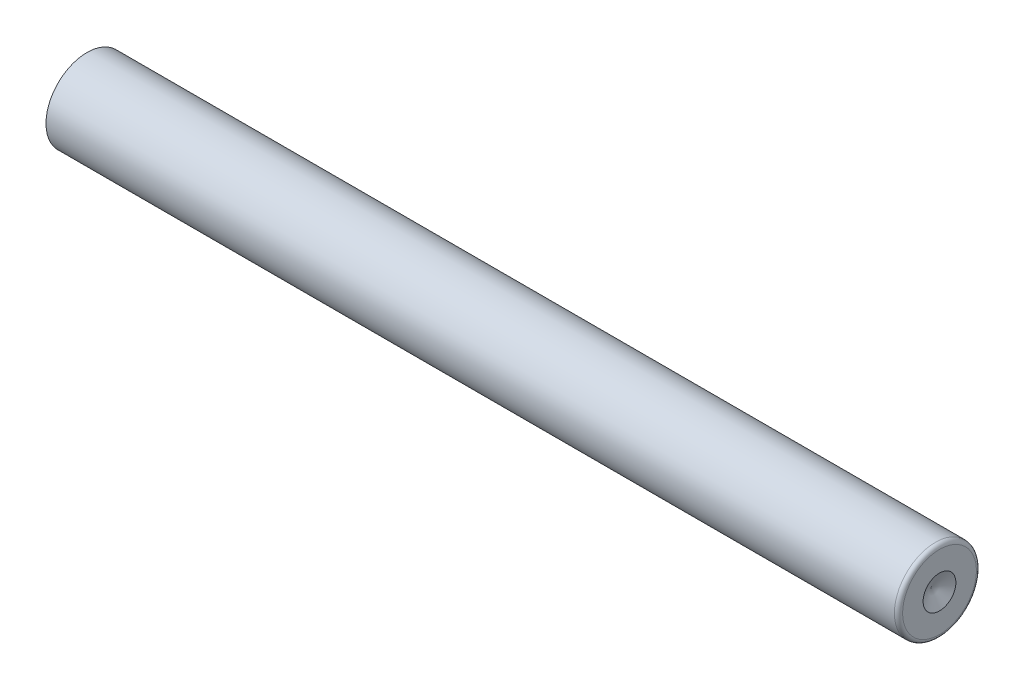
ISO-10303-21;
HEADER;
FILE_DESCRIPTION(('STEP AP214'),'2;1');
FILE_NAME('part.step','',(''),(''),'','','');
FILE_SCHEMA(('AUTOMOTIVE_DESIGN { 1 0 10303 214 1 1 1 1 }'));
ENDSEC;
DATA;
#1=APPLICATION_CONTEXT('core data for automotive mechanical design processes');
#2=APPLICATION_PROTOCOL_DEFINITION('international standard','automotive_design',2000,#1);
#3=PRODUCT_CONTEXT('',#1,'mechanical');
#4=PRODUCT('Part','Part','',(#3));
#5=PRODUCT_RELATED_PRODUCT_CATEGORY('part','',(#4));
#6=PRODUCT_DEFINITION_FORMATION('','',#4);
#7=PRODUCT_DEFINITION_CONTEXT('part definition',#1,'design');
#8=PRODUCT_DEFINITION('design','',#6,#7);
#9=PRODUCT_DEFINITION_SHAPE('','',#8);
#10=(LENGTH_UNIT() NAMED_UNIT(*) SI_UNIT(.MILLI.,.METRE.));
#11=(NAMED_UNIT(*) PLANE_ANGLE_UNIT() SI_UNIT($,.RADIAN.));
#12=(NAMED_UNIT(*) SI_UNIT($,.STERADIAN.) SOLID_ANGLE_UNIT());
#13=UNCERTAINTY_MEASURE_WITH_UNIT(LENGTH_MEASURE(1.E-05),#10,'distance_accuracy_value','');
#14=(GEOMETRIC_REPRESENTATION_CONTEXT(3) GLOBAL_UNCERTAINTY_ASSIGNED_CONTEXT((#13)) GLOBAL_UNIT_ASSIGNED_CONTEXT((#10,
#11,#12)) REPRESENTATION_CONTEXT('',''));
#15=CARTESIAN_POINT('',(0.,0.,0.));
#16=DIRECTION('',(0.,0.,1.));
#17=DIRECTION('',(1.,0.,0.));
#18=AXIS2_PLACEMENT_3D('',#15,#16,#17);
#19=CARTESIAN_POINT('',(0.,0.,0.));
#20=DIRECTION('',(1.,0.,0.));
#21=DIRECTION('',(0.,0.,-1.));
#22=AXIS2_PLACEMENT_3D('',#19,#20,#21);
#23=PLANE('',#22);
#24=CARTESIAN_POINT('',(0.,0.,0.));
#25=DIRECTION('',(-1.,0.,0.));
#26=DIRECTION('',(0.,0.,1.));
#27=AXIS2_PLACEMENT_3D('',#24,#25,#26);
#28=CIRCLE('',#27,2.5);
#29=CARTESIAN_POINT('',(0.,0.,2.5));
#30=VERTEX_POINT('',#29);
#31=EDGE_CURVE('E51',#30,#30,#28,.T.);
#32=ORIENTED_EDGE('',*,*,#31,.T.);
#33=EDGE_LOOP('',(#32));
#34=FACE_BOUND('',#33,.T.);
#35=ADVANCED_FACE('F33',(#34),#23,.F.);
#36=CARTESIAN_POINT('',(0.,0.,0.));
#37=DIRECTION('',(-1.,0.,0.));
#38=DIRECTION('',(0.,0.,1.));
#39=AXIS2_PLACEMENT_3D('',#36,#37,#38);
#40=CYLINDRICAL_SURFACE('',#39,2.5);
#41=CARTESIAN_POINT('',(51.75,0.,0.));
#42=DIRECTION('',(-1.,0.,0.));
#43=DIRECTION('',(0.,0.,1.));
#44=AXIS2_PLACEMENT_3D('',#41,#42,#43);
#45=CIRCLE('',#44,2.5);
#46=CARTESIAN_POINT('',(51.75,0.,2.5));
#47=VERTEX_POINT('',#46);
#48=EDGE_CURVE('E40',#47,#47,#45,.T.);
#49=ORIENTED_EDGE('',*,*,#48,.T.);
#50=EDGE_LOOP('',(#49));
#51=FACE_BOUND('',#50,.T.);
#52=ORIENTED_EDGE('',*,*,#31,.F.);
#53=EDGE_LOOP('',(#52));
#54=FACE_BOUND('',#53,.T.);
#55=ADVANCED_FACE('F58',(#51,#54),#40,.T.);
#56=CARTESIAN_POINT('',(52.,0.,0.));
#57=DIRECTION('',(-1.,0.,0.));
#58=DIRECTION('',(0.,0.,1.));
#59=AXIS2_PLACEMENT_3D('',#56,#57,#58);
#60=PLANE('',#59);
#61=CARTESIAN_POINT('',(52.,0.,0.));
#62=DIRECTION('',(1.,0.,0.));
#63=DIRECTION('',(0.,1.,0.));
#64=AXIS2_PLACEMENT_3D('',#61,#62,#63);
#65=CIRCLE('',#64,1.);
#66=CARTESIAN_POINT('',(52.,1.,0.));
#67=VERTEX_POINT('',#66);
#68=EDGE_CURVE('E49',#67,#67,#65,.T.);
#69=ORIENTED_EDGE('',*,*,#68,.F.);
#70=EDGE_LOOP('',(#69));
#71=FACE_BOUND('',#70,.T.);
#72=CARTESIAN_POINT('',(52.,0.,0.));
#73=DIRECTION('',(-1.,0.,0.));
#74=DIRECTION('',(0.,0.,1.));
#75=AXIS2_PLACEMENT_3D('',#72,#73,#74);
#76=CIRCLE('',#75,2.25);
#77=CARTESIAN_POINT('',(52.,0.,2.25));
#78=VERTEX_POINT('',#77);
#79=EDGE_CURVE('E11',#78,#78,#76,.F.);
#80=ORIENTED_EDGE('',*,*,#79,.T.);
#81=EDGE_LOOP('',(#80));
#82=FACE_BOUND('',#81,.T.);
#83=ADVANCED_FACE('F62',(#71,#82),#60,.F.);
#84=CARTESIAN_POINT('',(51.75,0.,0.));
#85=DIRECTION('',(-1.,0.,0.));
#86=DIRECTION('',(0.,0.,1.));
#87=AXIS2_PLACEMENT_3D('',#84,#85,#86);
#88=TOROIDAL_SURFACE('',#87,2.25,0.25);
#89=ORIENTED_EDGE('',*,*,#79,.F.);
#90=EDGE_LOOP('',(#89));
#91=FACE_BOUND('',#90,.T.);
#92=ORIENTED_EDGE('',*,*,#48,.F.);
#93=EDGE_LOOP('',(#92));
#94=FACE_BOUND('',#93,.T.);
#95=ADVANCED_FACE('F35',(#91,#94),#88,.T.);
#96=CARTESIAN_POINT('',(52.,0.,0.));
#97=DIRECTION('',(1.,0.,0.));
#98=DIRECTION('',(0.,1.,0.));
#99=AXIS2_PLACEMENT_3D('',#96,#97,#98);
#100=CONICAL_SURFACE('',#99,1.,1.1071487177941);
#101=CARTESIAN_POINT('',(51.5,0.,0.));
#102=VERTEX_POINT('',#101);
#103=VERTEX_LOOP('',#102);
#104=FACE_BOUND('',#103,.T.);
#105=ORIENTED_EDGE('',*,*,#68,.T.);
#106=EDGE_LOOP('',(#105));
#107=FACE_BOUND('',#106,.T.);
#108=ADVANCED_FACE('F43',(#104,#107),#100,.F.);
#109=CLOSED_SHELL('',(#35,#55,#83,#95,#108));
#110=MANIFOLD_SOLID_BREP('B2',#109);
#111=ADVANCED_BREP_SHAPE_REPRESENTATION('',(#18,#110),#14);
#112=SHAPE_DEFINITION_REPRESENTATION(#9,#111);
ENDSEC;
END-ISO-10303-21;
